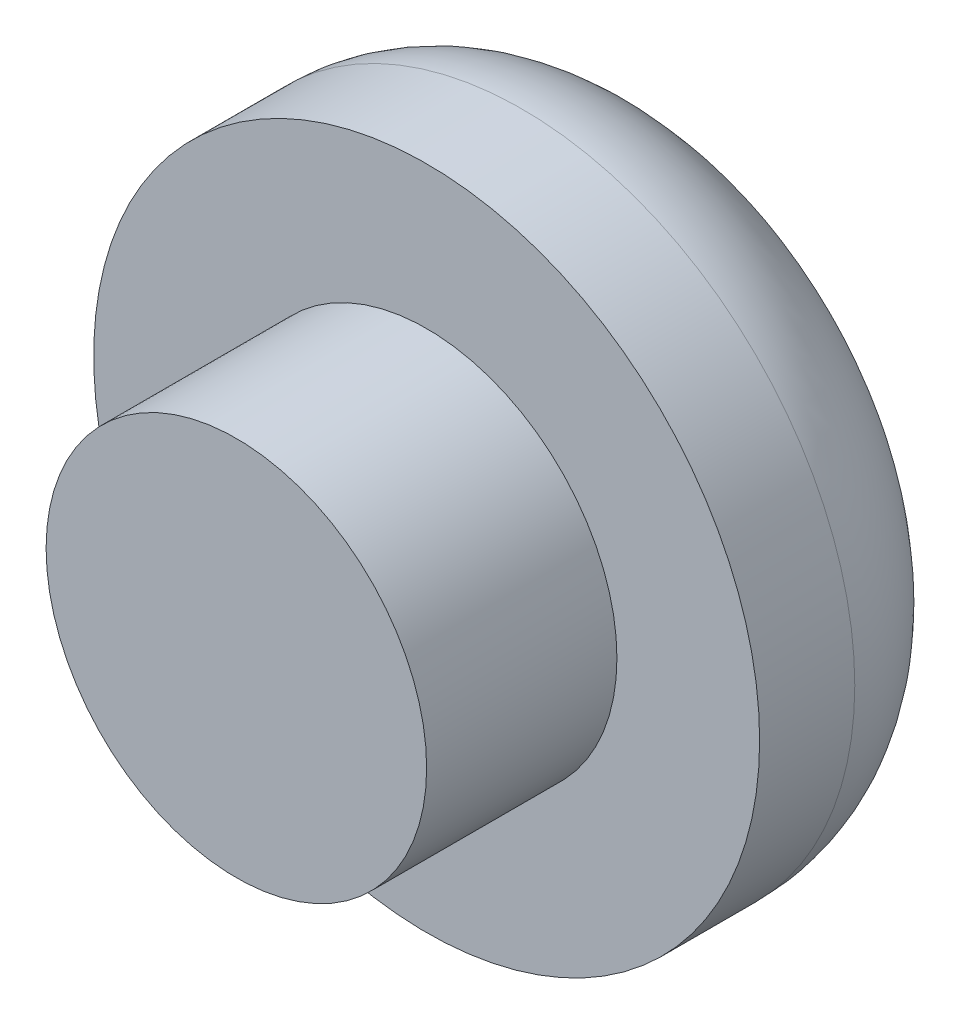
ISO-10303-21;
HEADER;
FILE_DESCRIPTION(('STEP AP214'),'2;1');
FILE_NAME('part.step','',(''),(''),'','','');
FILE_SCHEMA(('AUTOMOTIVE_DESIGN { 1 0 10303 214 1 1 1 1 }'));
ENDSEC;
DATA;
#1=APPLICATION_CONTEXT('core data for automotive mechanical design processes');
#2=APPLICATION_PROTOCOL_DEFINITION('international standard','automotive_design',2000,#1);
#3=PRODUCT_CONTEXT('',#1,'mechanical');
#4=PRODUCT('Part','Part','',(#3));
#5=PRODUCT_RELATED_PRODUCT_CATEGORY('part','',(#4));
#6=PRODUCT_DEFINITION_FORMATION('','',#4);
#7=PRODUCT_DEFINITION_CONTEXT('part definition',#1,'design');
#8=PRODUCT_DEFINITION('design','',#6,#7);
#9=PRODUCT_DEFINITION_SHAPE('','',#8);
#10=(LENGTH_UNIT() NAMED_UNIT(*) SI_UNIT(.MILLI.,.METRE.));
#11=(NAMED_UNIT(*) PLANE_ANGLE_UNIT() SI_UNIT($,.RADIAN.));
#12=(NAMED_UNIT(*) SI_UNIT($,.STERADIAN.) SOLID_ANGLE_UNIT());
#13=UNCERTAINTY_MEASURE_WITH_UNIT(LENGTH_MEASURE(1.E-05),#10,'distance_accuracy_value','');
#14=(GEOMETRIC_REPRESENTATION_CONTEXT(3) GLOBAL_UNCERTAINTY_ASSIGNED_CONTEXT((#13)) GLOBAL_UNIT_ASSIGNED_CONTEXT((#10,
#11,#12)) REPRESENTATION_CONTEXT('',''));
#15=CARTESIAN_POINT('',(0.,0.,0.));
#16=DIRECTION('',(0.,0.,1.));
#17=DIRECTION('',(1.,0.,0.));
#18=AXIS2_PLACEMENT_3D('',#15,#16,#17);
#19=CARTESIAN_POINT('',(0.,0.,5.));
#20=DIRECTION('',(0.,0.,1.));
#21=DIRECTION('',(1.,0.,0.));
#22=AXIS2_PLACEMENT_3D('',#19,#20,#21);
#23=PLANE('',#22);
#24=CARTESIAN_POINT('',(0.,0.,5.));
#25=DIRECTION('',(0.,0.,1.));
#26=DIRECTION('',(1.,0.,0.));
#27=AXIS2_PLACEMENT_3D('',#24,#25,#26);
#28=CIRCLE('',#27,7.);
#29=CARTESIAN_POINT('',(7.,0.,5.));
#30=VERTEX_POINT('',#29);
#31=EDGE_CURVE('E42',#30,#30,#28,.T.);
#32=ORIENTED_EDGE('',*,*,#31,.T.);
#33=EDGE_LOOP('',(#32));
#34=FACE_BOUND('',#33,.T.);
#35=CARTESIAN_POINT('',(0.,0.,5.));
#36=DIRECTION('',(0.,0.,1.));
#37=DIRECTION('',(1.,0.,0.));
#38=AXIS2_PLACEMENT_3D('',#35,#36,#37);
#39=CIRCLE('',#38,4.);
#40=CARTESIAN_POINT('',(4.,0.,5.));
#41=VERTEX_POINT('',#40);
#42=EDGE_CURVE('E51',#41,#41,#39,.T.);
#43=ORIENTED_EDGE('',*,*,#42,.F.);
#44=EDGE_LOOP('',(#43));
#45=FACE_BOUND('',#44,.T.);
#46=ADVANCED_FACE('F31',(#34,#45),#23,.T.);
#47=CARTESIAN_POINT('',(0.,0.,5.));
#48=DIRECTION('',(0.,0.,-1.));
#49=DIRECTION('',(-1.,0.,0.));
#50=AXIS2_PLACEMENT_3D('',#47,#48,#49);
#51=CYLINDRICAL_SURFACE('',#50,7.);
#52=CARTESIAN_POINT('',(0.,0.,3.));
#53=DIRECTION('',(0.,0.,1.));
#54=DIRECTION('',(1.,0.,0.));
#55=AXIS2_PLACEMENT_3D('',#52,#53,#54);
#56=CIRCLE('',#55,7.);
#57=CARTESIAN_POINT('',(7.,0.,3.));
#58=VERTEX_POINT('',#57);
#59=EDGE_CURVE('E38',#58,#58,#56,.T.);
#60=ORIENTED_EDGE('',*,*,#59,.T.);
#61=EDGE_LOOP('',(#60));
#62=FACE_BOUND('',#61,.T.);
#63=ORIENTED_EDGE('',*,*,#31,.F.);
#64=EDGE_LOOP('',(#63));
#65=FACE_BOUND('',#64,.T.);
#66=ADVANCED_FACE('F33',(#62,#65),#51,.T.);
#67=CARTESIAN_POINT('',(0.,0.,0.));
#68=DIRECTION('',(0.,0.,1.));
#69=DIRECTION('',(1.,0.,0.));
#70=AXIS2_PLACEMENT_3D('',#67,#68,#69);
#71=PLANE('',#70);
#72=CARTESIAN_POINT('',(0.,0.,0.));
#73=DIRECTION('',(0.,0.,1.));
#74=DIRECTION('',(1.,0.,0.));
#75=AXIS2_PLACEMENT_3D('',#72,#73,#74);
#76=CIRCLE('',#75,4.);
#77=CARTESIAN_POINT('',(4.,0.,0.));
#78=VERTEX_POINT('',#77);
#79=EDGE_CURVE('E10',#78,#78,#76,.F.);
#80=ORIENTED_EDGE('',*,*,#79,.T.);
#81=EDGE_LOOP('',(#80));
#82=FACE_BOUND('',#81,.T.);
#83=ADVANCED_FACE('F62',(#82),#71,.F.);
#84=CARTESIAN_POINT('',(0.,0.,3.));
#85=DIRECTION('',(0.,0.,1.));
#86=DIRECTION('',(1.,0.,0.));
#87=AXIS2_PLACEMENT_3D('',#84,#85,#86);
#88=TOROIDAL_SURFACE('',#87,4.,3.);
#89=ORIENTED_EDGE('',*,*,#79,.F.);
#90=EDGE_LOOP('',(#89));
#91=FACE_BOUND('',#90,.T.);
#92=ORIENTED_EDGE('',*,*,#59,.F.);
#93=EDGE_LOOP('',(#92));
#94=FACE_BOUND('',#93,.T.);
#95=ADVANCED_FACE('F66',(#91,#94),#88,.T.);
#96=CARTESIAN_POINT('',(0.,0.,9.));
#97=DIRECTION('',(0.,0.,-1.));
#98=DIRECTION('',(-1.,0.,0.));
#99=AXIS2_PLACEMENT_3D('',#96,#97,#98);
#100=CYLINDRICAL_SURFACE('',#99,4.);
#101=CARTESIAN_POINT('',(0.,0.,9.));
#102=DIRECTION('',(0.,0.,1.));
#103=DIRECTION('',(1.,0.,0.));
#104=AXIS2_PLACEMENT_3D('',#101,#102,#103);
#105=CIRCLE('',#104,4.);
#106=CARTESIAN_POINT('',(4.,0.,9.));
#107=VERTEX_POINT('',#106);
#108=EDGE_CURVE('E46',#107,#107,#105,.T.);
#109=ORIENTED_EDGE('',*,*,#108,.F.);
#110=EDGE_LOOP('',(#109));
#111=FACE_BOUND('',#110,.T.);
#112=ORIENTED_EDGE('',*,*,#42,.T.);
#113=EDGE_LOOP('',(#112));
#114=FACE_BOUND('',#113,.T.);
#115=ADVANCED_FACE('F55',(#111,#114),#100,.T.);
#116=CARTESIAN_POINT('',(0.,0.,9.));
#117=DIRECTION('',(0.,0.,1.));
#118=DIRECTION('',(1.,0.,0.));
#119=AXIS2_PLACEMENT_3D('',#116,#117,#118);
#120=PLANE('',#119);
#121=ORIENTED_EDGE('',*,*,#108,.T.);
#122=EDGE_LOOP('',(#121));
#123=FACE_BOUND('',#122,.T.);
#124=ADVANCED_FACE('F72',(#123),#120,.T.);
#125=CLOSED_SHELL('',(#46,#66,#83,#95,#115,#124));
#126=MANIFOLD_SOLID_BREP('B2',#125);
#127=ADVANCED_BREP_SHAPE_REPRESENTATION('',(#18,#126),#14);
#128=SHAPE_DEFINITION_REPRESENTATION(#9,#127);
ENDSEC;
END-ISO-10303-21;
